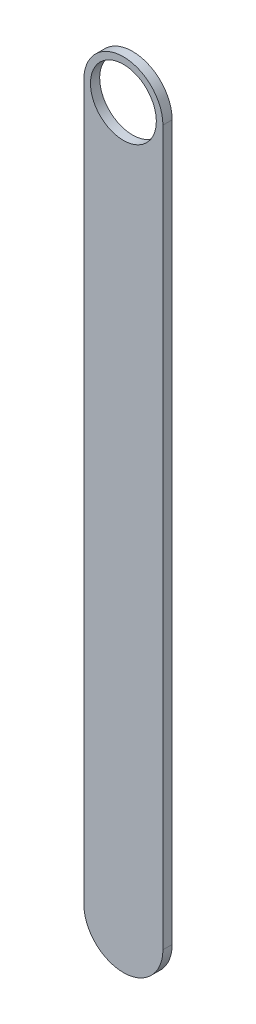
ISO-10303-21;
HEADER;
FILE_DESCRIPTION(('STEP AP214'),'2;1');
FILE_NAME('part.step','',(''),(''),'','','');
FILE_SCHEMA(('AUTOMOTIVE_DESIGN { 1 0 10303 214 1 1 1 1 }'));
ENDSEC;
DATA;
#1=APPLICATION_CONTEXT('core data for automotive mechanical design processes');
#2=APPLICATION_PROTOCOL_DEFINITION('international standard','automotive_design',2000,#1);
#3=PRODUCT_CONTEXT('',#1,'mechanical');
#4=PRODUCT('Part','Part','',(#3));
#5=PRODUCT_RELATED_PRODUCT_CATEGORY('part','',(#4));
#6=PRODUCT_DEFINITION_FORMATION('','',#4);
#7=PRODUCT_DEFINITION_CONTEXT('part definition',#1,'design');
#8=PRODUCT_DEFINITION('design','',#6,#7);
#9=PRODUCT_DEFINITION_SHAPE('','',#8);
#10=(LENGTH_UNIT() NAMED_UNIT(*) SI_UNIT(.MILLI.,.METRE.));
#11=(NAMED_UNIT(*) PLANE_ANGLE_UNIT() SI_UNIT($,.RADIAN.));
#12=(NAMED_UNIT(*) SI_UNIT($,.STERADIAN.) SOLID_ANGLE_UNIT());
#13=UNCERTAINTY_MEASURE_WITH_UNIT(LENGTH_MEASURE(1.E-05),#10,'distance_accuracy_value','');
#14=(GEOMETRIC_REPRESENTATION_CONTEXT(3) GLOBAL_UNCERTAINTY_ASSIGNED_CONTEXT((#13)) GLOBAL_UNIT_ASSIGNED_CONTEXT((#10,
#11,#12)) REPRESENTATION_CONTEXT('',''));
#15=CARTESIAN_POINT('',(0.,0.,0.));
#16=DIRECTION('',(0.,0.,1.));
#17=DIRECTION('',(1.,0.,0.));
#18=AXIS2_PLACEMENT_3D('',#15,#16,#17);
#19=CARTESIAN_POINT('',(127.68,-73.3,-0.045));
#20=DIRECTION('',(0.,0.,-1.));
#21=DIRECTION('',(0.,-1.,0.));
#22=AXIS2_PLACEMENT_3D('',#19,#20,#21);
#23=CYLINDRICAL_SURFACE('',#22,0.125);
#24=CARTESIAN_POINT('',(127.68,-73.3,1.6));
#25=DIRECTION('',(0.,0.,-1.));
#26=DIRECTION('',(0.,-1.,0.));
#27=AXIS2_PLACEMENT_3D('',#24,#25,#26);
#28=CIRCLE('',#27,0.125);
#29=CARTESIAN_POINT('',(127.68,-73.425,1.6));
#30=VERTEX_POINT('',#29);
#31=EDGE_CURVE('E125',#30,#30,#28,.T.);
#32=ORIENTED_EDGE('',*,*,#31,.T.);
#33=DIRECTION('',(0.,0.,1.));
#34=VECTOR('',#33,1.);
#35=CARTESIAN_POINT('',(127.68,-73.425,-0.045));
#36=LINE('',#35,#34);
#37=CARTESIAN_POINT('',(127.68,-73.425,1.635));
#38=VERTEX_POINT('',#37);
#39=EDGE_CURVE('E11',#30,#38,#36,.T.);
#40=ORIENTED_EDGE('',*,*,#39,.T.);
#41=CARTESIAN_POINT('',(127.68,-73.3,1.635));
#42=DIRECTION('',(0.,0.,-1.));
#43=DIRECTION('',(0.,-1.,0.));
#44=AXIS2_PLACEMENT_3D('',#41,#42,#43);
#45=CIRCLE('',#44,0.125);
#46=EDGE_CURVE('E26',#38,#38,#45,.T.);
#47=ORIENTED_EDGE('',*,*,#46,.F.);
#48=ORIENTED_EDGE('',*,*,#39,.F.);
#49=EDGE_LOOP('',(#32,#40,#47,#48));
#50=FACE_BOUND('',#49,.T.);
#51=ADVANCED_FACE('F17',(#50),#23,.F.);
#52=CARTESIAN_POINT('',(127.83,-76.01,1.6));
#53=DIRECTION('',(-1.,0.,0.));
#54=DIRECTION('',(0.,0.,1.));
#55=AXIS2_PLACEMENT_3D('',#52,#53,#54);
#56=PLANE('',#55);
#57=DIRECTION('',(0.,1.,0.));
#58=VECTOR('',#57,1.);
#59=CARTESIAN_POINT('',(127.83,-76.01,1.6));
#60=LINE('',#59,#58);
#61=CARTESIAN_POINT('',(127.83,-76.01,1.6));
#62=VERTEX_POINT('',#61);
#63=CARTESIAN_POINT('',(127.83,-73.3,1.6));
#64=VERTEX_POINT('',#63);
#65=EDGE_CURVE('E115',#62,#64,#60,.T.);
#66=ORIENTED_EDGE('',*,*,#65,.T.);
#67=DIRECTION('',(0.,0.,1.));
#68=VECTOR('',#67,1.);
#69=CARTESIAN_POINT('',(127.83,-73.3,1.6));
#70=LINE('',#69,#68);
#71=CARTESIAN_POINT('',(127.83,-73.3,1.635));
#72=VERTEX_POINT('',#71);
#73=EDGE_CURVE('E84',#64,#72,#70,.T.);
#74=ORIENTED_EDGE('',*,*,#73,.T.);
#75=DIRECTION('',(0.,1.,0.));
#76=VECTOR('',#75,1.);
#77=CARTESIAN_POINT('',(127.83,-76.01,1.635));
#78=LINE('',#77,#76);
#79=CARTESIAN_POINT('',(127.83,-76.01,1.635));
#80=VERTEX_POINT('',#79);
#81=EDGE_CURVE('E122',#80,#72,#78,.T.);
#82=ORIENTED_EDGE('',*,*,#81,.F.);
#83=DIRECTION('',(0.,0.,1.));
#84=VECTOR('',#83,1.);
#85=CARTESIAN_POINT('',(127.83,-76.01,1.6));
#86=LINE('',#85,#84);
#87=EDGE_CURVE('E116',#62,#80,#86,.T.);
#88=ORIENTED_EDGE('',*,*,#87,.F.);
#89=EDGE_LOOP('',(#66,#74,#82,#88));
#90=FACE_BOUND('',#89,.T.);
#91=ADVANCED_FACE('F19',(#90),#56,.F.);
#92=CARTESIAN_POINT('',(127.53,-73.3,1.635));
#93=DIRECTION('',(0.,0.,1.));
#94=DIRECTION('',(1.,0.,0.));
#95=AXIS2_PLACEMENT_3D('',#92,#93,#94);
#96=PLANE('',#95);
#97=ORIENTED_EDGE('',*,*,#46,.T.);
#98=EDGE_LOOP('',(#97));
#99=FACE_BOUND('',#98,.T.);
#100=DIRECTION('',(0.,-1.,0.));
#101=VECTOR('',#100,1.);
#102=CARTESIAN_POINT('',(127.53,-73.3,1.635));
#103=LINE('',#102,#101);
#104=CARTESIAN_POINT('',(127.53,-73.3,1.635));
#105=VERTEX_POINT('',#104);
#106=CARTESIAN_POINT('',(127.53,-76.01,1.635));
#107=VERTEX_POINT('',#106);
#108=EDGE_CURVE('E96',#105,#107,#103,.T.);
#109=ORIENTED_EDGE('',*,*,#108,.T.);
#110=CARTESIAN_POINT('',(127.68,-76.01,1.635));
#111=DIRECTION('',(0.,0.,1.));
#112=DIRECTION('',(-1.,0.,0.));
#113=AXIS2_PLACEMENT_3D('',#110,#111,#112);
#114=CIRCLE('',#113,0.15);
#115=EDGE_CURVE('E112',#107,#80,#114,.T.);
#116=ORIENTED_EDGE('',*,*,#115,.T.);
#117=ORIENTED_EDGE('',*,*,#81,.T.);
#118=CARTESIAN_POINT('',(127.68,-73.3,1.635));
#119=DIRECTION('',(0.,0.,1.));
#120=DIRECTION('',(1.,0.,0.));
#121=AXIS2_PLACEMENT_3D('',#118,#119,#120);
#122=CIRCLE('',#121,0.15);
#123=EDGE_CURVE('E88',#72,#105,#122,.T.);
#124=ORIENTED_EDGE('',*,*,#123,.T.);
#125=EDGE_LOOP('',(#109,#116,#117,#124));
#126=FACE_BOUND('',#125,.T.);
#127=ADVANCED_FACE('F140',(#99,#126),#96,.T.);
#128=CARTESIAN_POINT('',(127.53,-73.3,1.6));
#129=DIRECTION('',(0.,0.,1.));
#130=DIRECTION('',(1.,0.,0.));
#131=AXIS2_PLACEMENT_3D('',#128,#129,#130);
#132=PLANE('',#131);
#133=ORIENTED_EDGE('',*,*,#31,.F.);
#134=EDGE_LOOP('',(#133));
#135=FACE_BOUND('',#134,.T.);
#136=CARTESIAN_POINT('',(127.68,-73.3,1.6));
#137=DIRECTION('',(0.,0.,1.));
#138=DIRECTION('',(1.,0.,0.));
#139=AXIS2_PLACEMENT_3D('',#136,#137,#138);
#140=CIRCLE('',#139,0.15);
#141=CARTESIAN_POINT('',(127.53,-73.3,1.6));
#142=VERTEX_POINT('',#141);
#143=EDGE_CURVE('E77',#64,#142,#140,.T.);
#144=ORIENTED_EDGE('',*,*,#143,.F.);
#145=ORIENTED_EDGE('',*,*,#65,.F.);
#146=CARTESIAN_POINT('',(127.68,-76.01,1.6));
#147=DIRECTION('',(0.,0.,1.));
#148=DIRECTION('',(-1.,0.,0.));
#149=AXIS2_PLACEMENT_3D('',#146,#147,#148);
#150=CIRCLE('',#149,0.15);
#151=CARTESIAN_POINT('',(127.53,-76.01,1.6));
#152=VERTEX_POINT('',#151);
#153=EDGE_CURVE('E101',#152,#62,#150,.T.);
#154=ORIENTED_EDGE('',*,*,#153,.F.);
#155=DIRECTION('',(0.,-1.,0.));
#156=VECTOR('',#155,1.);
#157=CARTESIAN_POINT('',(127.53,-73.3,1.6));
#158=LINE('',#157,#156);
#159=EDGE_CURVE('E94',#142,#152,#158,.T.);
#160=ORIENTED_EDGE('',*,*,#159,.F.);
#161=EDGE_LOOP('',(#144,#145,#154,#160));
#162=FACE_BOUND('',#161,.T.);
#163=ADVANCED_FACE('F99',(#135,#162),#132,.F.);
#164=CARTESIAN_POINT('',(127.68,-76.01,1.6));
#165=DIRECTION('',(0.,0.,-1.));
#166=DIRECTION('',(-1.,0.,0.));
#167=AXIS2_PLACEMENT_3D('',#164,#165,#166);
#168=CYLINDRICAL_SURFACE('',#167,0.15);
#169=ORIENTED_EDGE('',*,*,#153,.T.);
#170=ORIENTED_EDGE('',*,*,#87,.T.);
#171=ORIENTED_EDGE('',*,*,#115,.F.);
#172=DIRECTION('',(0.,0.,1.));
#173=VECTOR('',#172,1.);
#174=CARTESIAN_POINT('',(127.53,-76.01,1.6));
#175=LINE('',#174,#173);
#176=EDGE_CURVE('E104',#152,#107,#175,.T.);
#177=ORIENTED_EDGE('',*,*,#176,.F.);
#178=EDGE_LOOP('',(#169,#170,#171,#177));
#179=FACE_BOUND('',#178,.T.);
#180=ADVANCED_FACE('F156',(#179),#168,.T.);
#181=CARTESIAN_POINT('',(127.68,-73.3,1.6));
#182=DIRECTION('',(0.,0.,-1.));
#183=DIRECTION('',(1.,0.,0.));
#184=AXIS2_PLACEMENT_3D('',#181,#182,#183);
#185=CYLINDRICAL_SURFACE('',#184,0.15);
#186=ORIENTED_EDGE('',*,*,#143,.T.);
#187=DIRECTION('',(0.,0.,1.));
#188=VECTOR('',#187,1.);
#189=CARTESIAN_POINT('',(127.53,-73.3,1.6));
#190=LINE('',#189,#188);
#191=EDGE_CURVE('E81',#142,#105,#190,.T.);
#192=ORIENTED_EDGE('',*,*,#191,.T.);
#193=ORIENTED_EDGE('',*,*,#123,.F.);
#194=ORIENTED_EDGE('',*,*,#73,.F.);
#195=EDGE_LOOP('',(#186,#192,#193,#194));
#196=FACE_BOUND('',#195,.T.);
#197=ADVANCED_FACE('F79',(#196),#185,.T.);
#198=CARTESIAN_POINT('',(127.53,-73.3,1.6));
#199=DIRECTION('',(1.,0.,0.));
#200=DIRECTION('',(0.,1.,0.));
#201=AXIS2_PLACEMENT_3D('',#198,#199,#200);
#202=PLANE('',#201);
#203=ORIENTED_EDGE('',*,*,#159,.T.);
#204=ORIENTED_EDGE('',*,*,#176,.T.);
#205=ORIENTED_EDGE('',*,*,#108,.F.);
#206=ORIENTED_EDGE('',*,*,#191,.F.);
#207=EDGE_LOOP('',(#203,#204,#205,#206));
#208=FACE_BOUND('',#207,.T.);
#209=ADVANCED_FACE('F92',(#208),#202,.F.);
#210=CLOSED_SHELL('',(#51,#91,#127,#163,#180,#197,#209));
#211=MANIFOLD_SOLID_BREP('B1',#210);
#212=ADVANCED_BREP_SHAPE_REPRESENTATION('',(#18,#211),#14);
#213=SHAPE_DEFINITION_REPRESENTATION(#9,#212);
ENDSEC;
END-ISO-10303-21;
